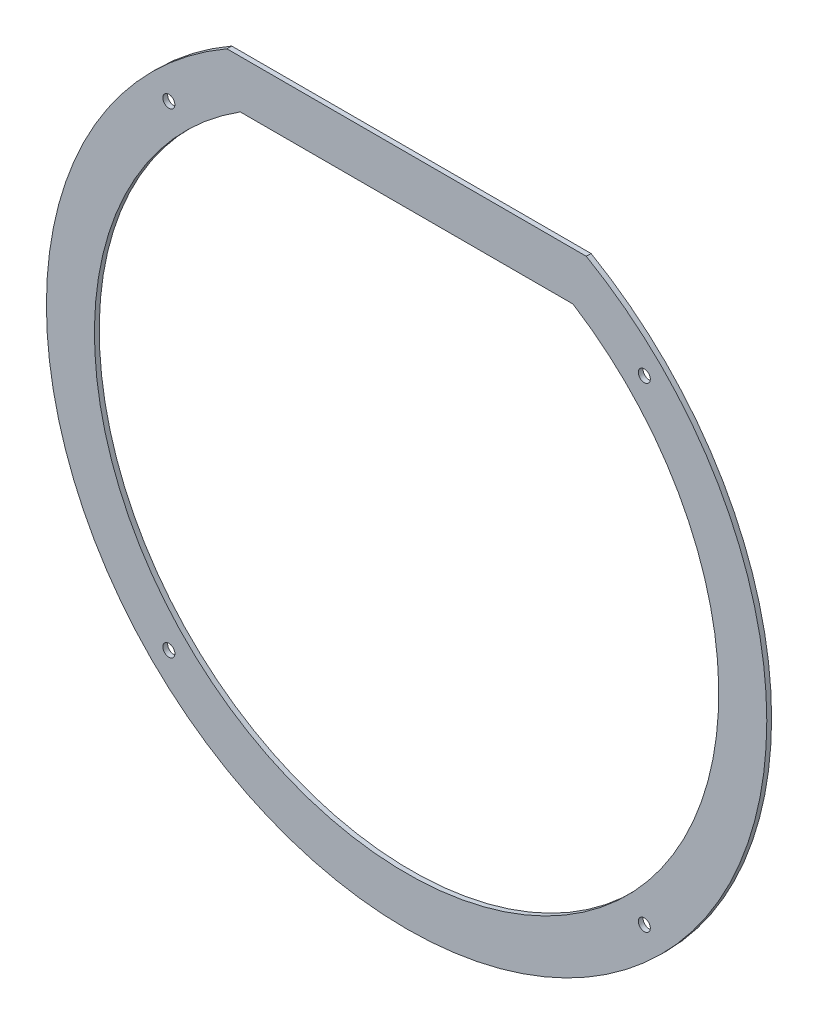
ISO-10303-21;
HEADER;
FILE_DESCRIPTION(('STEP AP214'),'2;1');
FILE_NAME('part.step','',(''),(''),'','','');
FILE_SCHEMA(('AUTOMOTIVE_DESIGN { 1 0 10303 214 1 1 1 1 }'));
ENDSEC;
DATA;
#1=APPLICATION_CONTEXT('core data for automotive mechanical design processes');
#2=APPLICATION_PROTOCOL_DEFINITION('international standard','automotive_design',2000,#1);
#3=PRODUCT_CONTEXT('',#1,'mechanical');
#4=PRODUCT('Part','Part','',(#3));
#5=PRODUCT_RELATED_PRODUCT_CATEGORY('part','',(#4));
#6=PRODUCT_DEFINITION_FORMATION('','',#4);
#7=PRODUCT_DEFINITION_CONTEXT('part definition',#1,'design');
#8=PRODUCT_DEFINITION('design','',#6,#7);
#9=PRODUCT_DEFINITION_SHAPE('','',#8);
#10=(LENGTH_UNIT() NAMED_UNIT(*) SI_UNIT(.MILLI.,.METRE.));
#11=(NAMED_UNIT(*) PLANE_ANGLE_UNIT() SI_UNIT($,.RADIAN.));
#12=(NAMED_UNIT(*) SI_UNIT($,.STERADIAN.) SOLID_ANGLE_UNIT());
#13=UNCERTAINTY_MEASURE_WITH_UNIT(LENGTH_MEASURE(1.E-05),#10,'distance_accuracy_value','');
#14=(GEOMETRIC_REPRESENTATION_CONTEXT(3) GLOBAL_UNCERTAINTY_ASSIGNED_CONTEXT((#13)) GLOBAL_UNIT_ASSIGNED_CONTEXT((#10,
#11,#12)) REPRESENTATION_CONTEXT('',''));
#15=CARTESIAN_POINT('',(0.,0.,0.));
#16=DIRECTION('',(0.,0.,1.));
#17=DIRECTION('',(1.,0.,0.));
#18=AXIS2_PLACEMENT_3D('',#15,#16,#17);
#19=CARTESIAN_POINT('',(0.,0.,2.));
#20=DIRECTION('',(0.,0.,1.));
#21=DIRECTION('',(1.,0.,0.));
#22=AXIS2_PLACEMENT_3D('',#19,#20,#21);
#23=PLANE('',#22);
#24=CARTESIAN_POINT('',(98.9949493661172,-98.9949493661161,2.));
#25=DIRECTION('',(0.,0.,1.));
#26=DIRECTION('',(1.,0.,0.));
#27=AXIS2_PLACEMENT_3D('',#24,#25,#26);
#28=CIRCLE('',#27,2.5);
#29=CARTESIAN_POINT('',(101.494949366117,-98.9949493661161,2.));
#30=VERTEX_POINT('',#29);
#31=EDGE_CURVE('E217',#30,#30,#28,.T.);
#32=ORIENTED_EDGE('',*,*,#31,.F.);
#33=EDGE_LOOP('',(#32));
#34=FACE_BOUND('',#33,.T.);
#35=CARTESIAN_POINT('',(-98.9949493661172,98.9949493661161,2.));
#36=DIRECTION('',(0.,0.,1.));
#37=DIRECTION('',(1.,0.,0.));
#38=AXIS2_PLACEMENT_3D('',#35,#36,#37);
#39=CIRCLE('',#38,2.5);
#40=CARTESIAN_POINT('',(-96.4949493661172,98.9949493661161,2.));
#41=VERTEX_POINT('',#40);
#42=EDGE_CURVE('E91',#41,#41,#39,.T.);
#43=ORIENTED_EDGE('',*,*,#42,.F.);
#44=EDGE_LOOP('',(#43));
#45=FACE_BOUND('',#44,.T.);
#46=CARTESIAN_POINT('',(0.,0.,2.));
#47=DIRECTION('',(0.,0.,1.));
#48=DIRECTION('',(1.,0.,0.));
#49=AXIS2_PLACEMENT_3D('',#46,#47,#48);
#50=CIRCLE('',#49,150.);
#51=CARTESIAN_POINT('',(-74.8331477354789,130.,2.));
#52=VERTEX_POINT('',#51);
#53=CARTESIAN_POINT('',(74.8331477354789,130.,2.));
#54=VERTEX_POINT('',#53);
#55=EDGE_CURVE('E95',#52,#54,#50,.T.);
#56=ORIENTED_EDGE('',*,*,#55,.T.);
#57=DIRECTION('',(-1.,0.,0.));
#58=VECTOR('',#57,1.);
#59=CARTESIAN_POINT('',(-74.8331477354789,130.,2.));
#60=LINE('',#59,#58);
#61=EDGE_CURVE('E98',#54,#52,#60,.T.);
#62=ORIENTED_EDGE('',*,*,#61,.T.);
#63=EDGE_LOOP('',(#56,#62));
#64=FACE_BOUND('',#63,.T.);
#65=DIRECTION('',(-1.,0.,0.));
#66=VECTOR('',#65,1.);
#67=CARTESIAN_POINT('',(-69.2820323027551,110.,2.));
#68=LINE('',#67,#66);
#69=CARTESIAN_POINT('',(69.2820323027551,110.,2.));
#70=VERTEX_POINT('',#69);
#71=CARTESIAN_POINT('',(-69.2820323027551,110.,2.));
#72=VERTEX_POINT('',#71);
#73=EDGE_CURVE('E73',#70,#72,#68,.T.);
#74=ORIENTED_EDGE('',*,*,#73,.F.);
#75=CARTESIAN_POINT('',(0.,0.,2.));
#76=DIRECTION('',(0.,0.,1.));
#77=DIRECTION('',(1.,0.,0.));
#78=AXIS2_PLACEMENT_3D('',#75,#76,#77);
#79=CIRCLE('',#78,130.);
#80=EDGE_CURVE('E79',#72,#70,#79,.T.);
#81=ORIENTED_EDGE('',*,*,#80,.F.);
#82=EDGE_LOOP('',(#74,#81));
#83=FACE_BOUND('',#82,.T.);
#84=CARTESIAN_POINT('',(-98.9949493661164,-98.9949493661169,2.));
#85=DIRECTION('',(0.,0.,1.));
#86=DIRECTION('',(1.,0.,0.));
#87=AXIS2_PLACEMENT_3D('',#84,#85,#86);
#88=CIRCLE('',#87,2.5);
#89=CARTESIAN_POINT('',(-96.4949493661164,-98.9949493661169,2.));
#90=VERTEX_POINT('',#89);
#91=EDGE_CURVE('E223',#90,#90,#88,.T.);
#92=ORIENTED_EDGE('',*,*,#91,.F.);
#93=EDGE_LOOP('',(#92));
#94=FACE_BOUND('',#93,.T.);
#95=CARTESIAN_POINT('',(98.9949493661164,98.9949493661169,2.));
#96=DIRECTION('',(0.,0.,1.));
#97=DIRECTION('',(1.,0.,0.));
#98=AXIS2_PLACEMENT_3D('',#95,#96,#97);
#99=CIRCLE('',#98,2.5);
#100=CARTESIAN_POINT('',(101.494949366116,98.9949493661169,2.));
#101=VERTEX_POINT('',#100);
#102=EDGE_CURVE('E208',#101,#101,#99,.T.);
#103=ORIENTED_EDGE('',*,*,#102,.F.);
#104=EDGE_LOOP('',(#103));
#105=FACE_BOUND('',#104,.T.);
#106=ADVANCED_FACE('F33',(#34,#45,#64,#83,#94,#105),#23,.T.);
#107=CARTESIAN_POINT('',(0.,0.,0.));
#108=DIRECTION('',(0.,0.,1.));
#109=DIRECTION('',(1.,0.,0.));
#110=AXIS2_PLACEMENT_3D('',#107,#108,#109);
#111=PLANE('',#110);
#112=CARTESIAN_POINT('',(98.9949493661172,-98.9949493661161,0.));
#113=DIRECTION('',(0.,0.,1.));
#114=DIRECTION('',(1.,0.,0.));
#115=AXIS2_PLACEMENT_3D('',#112,#113,#114);
#116=CIRCLE('',#115,2.5);
#117=CARTESIAN_POINT('',(101.494949366117,-98.9949493661161,0.));
#118=VERTEX_POINT('',#117);
#119=EDGE_CURVE('E214',#118,#118,#116,.T.);
#120=ORIENTED_EDGE('',*,*,#119,.T.);
#121=EDGE_LOOP('',(#120));
#122=FACE_BOUND('',#121,.T.);
#123=CARTESIAN_POINT('',(-98.9949493661172,98.9949493661161,0.));
#124=DIRECTION('',(0.,0.,1.));
#125=DIRECTION('',(1.,0.,0.));
#126=AXIS2_PLACEMENT_3D('',#123,#124,#125);
#127=CIRCLE('',#126,2.5);
#128=CARTESIAN_POINT('',(-96.4949493661172,98.9949493661161,0.));
#129=VERTEX_POINT('',#128);
#130=EDGE_CURVE('E88',#129,#129,#127,.T.);
#131=ORIENTED_EDGE('',*,*,#130,.T.);
#132=EDGE_LOOP('',(#131));
#133=FACE_BOUND('',#132,.T.);
#134=CARTESIAN_POINT('',(0.,0.,0.));
#135=DIRECTION('',(0.,0.,1.));
#136=DIRECTION('',(1.,0.,0.));
#137=AXIS2_PLACEMENT_3D('',#134,#135,#136);
#138=CIRCLE('',#137,150.);
#139=CARTESIAN_POINT('',(-74.8331477354789,130.,0.));
#140=VERTEX_POINT('',#139);
#141=CARTESIAN_POINT('',(74.8331477354789,130.,0.));
#142=VERTEX_POINT('',#141);
#143=EDGE_CURVE('E94',#140,#142,#138,.T.);
#144=ORIENTED_EDGE('',*,*,#143,.F.);
#145=DIRECTION('',(-1.,0.,0.));
#146=VECTOR('',#145,1.);
#147=CARTESIAN_POINT('',(-74.8331477354789,130.,0.));
#148=LINE('',#147,#146);
#149=EDGE_CURVE('E99',#142,#140,#148,.T.);
#150=ORIENTED_EDGE('',*,*,#149,.F.);
#151=EDGE_LOOP('',(#144,#150));
#152=FACE_BOUND('',#151,.T.);
#153=CARTESIAN_POINT('',(0.,0.,0.));
#154=DIRECTION('',(0.,0.,1.));
#155=DIRECTION('',(1.,0.,0.));
#156=AXIS2_PLACEMENT_3D('',#153,#154,#155);
#157=CIRCLE('',#156,130.);
#158=CARTESIAN_POINT('',(-69.2820323027551,110.,0.));
#159=VERTEX_POINT('',#158);
#160=CARTESIAN_POINT('',(69.2820323027551,110.,0.));
#161=VERTEX_POINT('',#160);
#162=EDGE_CURVE('E55',#159,#161,#157,.T.);
#163=ORIENTED_EDGE('',*,*,#162,.T.);
#164=DIRECTION('',(-1.,0.,0.));
#165=VECTOR('',#164,1.);
#166=CARTESIAN_POINT('',(-69.2820323027551,110.,0.));
#167=LINE('',#166,#165);
#168=EDGE_CURVE('E84',#161,#159,#167,.T.);
#169=ORIENTED_EDGE('',*,*,#168,.T.);
#170=EDGE_LOOP('',(#163,#169));
#171=FACE_BOUND('',#170,.T.);
#172=CARTESIAN_POINT('',(-98.9949493661164,-98.9949493661169,0.));
#173=DIRECTION('',(0.,0.,1.));
#174=DIRECTION('',(1.,0.,0.));
#175=AXIS2_PLACEMENT_3D('',#172,#173,#174);
#176=CIRCLE('',#175,2.5);
#177=CARTESIAN_POINT('',(-96.4949493661164,-98.9949493661169,0.));
#178=VERTEX_POINT('',#177);
#179=EDGE_CURVE('E220',#178,#178,#176,.T.);
#180=ORIENTED_EDGE('',*,*,#179,.T.);
#181=EDGE_LOOP('',(#180));
#182=FACE_BOUND('',#181,.T.);
#183=CARTESIAN_POINT('',(98.9949493661164,98.9949493661169,0.));
#184=DIRECTION('',(0.,0.,1.));
#185=DIRECTION('',(1.,0.,0.));
#186=AXIS2_PLACEMENT_3D('',#183,#184,#185);
#187=CIRCLE('',#186,2.5);
#188=CARTESIAN_POINT('',(101.494949366116,98.9949493661169,0.));
#189=VERTEX_POINT('',#188);
#190=EDGE_CURVE('E211',#189,#189,#187,.T.);
#191=ORIENTED_EDGE('',*,*,#190,.T.);
#192=EDGE_LOOP('',(#191));
#193=FACE_BOUND('',#192,.T.);
#194=ADVANCED_FACE('F111',(#122,#133,#152,#171,#182,#193),#111,.F.);
#195=CARTESIAN_POINT('',(0.,0.,2.));
#196=DIRECTION('',(0.,0.,-1.));
#197=DIRECTION('',(-1.,0.,0.));
#198=AXIS2_PLACEMENT_3D('',#195,#196,#197);
#199=CYLINDRICAL_SURFACE('',#198,150.);
#200=ORIENTED_EDGE('',*,*,#143,.T.);
#201=DIRECTION('',(0.,0.,-1.));
#202=VECTOR('',#201,1.);
#203=CARTESIAN_POINT('',(74.8331477354789,130.,2.));
#204=LINE('',#203,#202);
#205=EDGE_CURVE('E11',#54,#142,#204,.T.);
#206=ORIENTED_EDGE('',*,*,#205,.F.);
#207=ORIENTED_EDGE('',*,*,#55,.F.);
#208=DIRECTION('',(0.,0.,-1.));
#209=VECTOR('',#208,1.);
#210=CARTESIAN_POINT('',(-74.8331477354789,130.,2.));
#211=LINE('',#210,#209);
#212=EDGE_CURVE('E41',#52,#140,#211,.T.);
#213=ORIENTED_EDGE('',*,*,#212,.T.);
#214=EDGE_LOOP('',(#200,#206,#207,#213));
#215=FACE_BOUND('',#214,.T.);
#216=ADVANCED_FACE('F35',(#215),#199,.T.);
#217=CARTESIAN_POINT('',(-74.8331477354789,130.,2.));
#218=DIRECTION('',(0.,-1.,0.));
#219=DIRECTION('',(0.,0.,-1.));
#220=AXIS2_PLACEMENT_3D('',#217,#218,#219);
#221=PLANE('',#220);
#222=ORIENTED_EDGE('',*,*,#149,.T.);
#223=ORIENTED_EDGE('',*,*,#212,.F.);
#224=ORIENTED_EDGE('',*,*,#61,.F.);
#225=ORIENTED_EDGE('',*,*,#205,.T.);
#226=EDGE_LOOP('',(#222,#223,#224,#225));
#227=FACE_BOUND('',#226,.T.);
#228=ADVANCED_FACE('F113',(#227),#221,.F.);
#229=CARTESIAN_POINT('',(0.,0.,2.));
#230=DIRECTION('',(0.,0.,-1.));
#231=DIRECTION('',(-1.,0.,0.));
#232=AXIS2_PLACEMENT_3D('',#229,#230,#231);
#233=CYLINDRICAL_SURFACE('',#232,130.);
#234=ORIENTED_EDGE('',*,*,#162,.F.);
#235=DIRECTION('',(0.,0.,-1.));
#236=VECTOR('',#235,1.);
#237=CARTESIAN_POINT('',(-69.2820323027551,110.,2.));
#238=LINE('',#237,#236);
#239=EDGE_CURVE('E75',#72,#159,#238,.T.);
#240=ORIENTED_EDGE('',*,*,#239,.F.);
#241=ORIENTED_EDGE('',*,*,#80,.T.);
#242=DIRECTION('',(0.,0.,-1.));
#243=VECTOR('',#242,1.);
#244=CARTESIAN_POINT('',(69.2820323027551,110.,2.));
#245=LINE('',#244,#243);
#246=EDGE_CURVE('E48',#70,#161,#245,.T.);
#247=ORIENTED_EDGE('',*,*,#246,.T.);
#248=EDGE_LOOP('',(#234,#240,#241,#247));
#249=FACE_BOUND('',#248,.T.);
#250=ADVANCED_FACE('F81',(#249),#233,.F.);
#251=CARTESIAN_POINT('',(-69.2820323027551,110.,2.));
#252=DIRECTION('',(0.,-1.,0.));
#253=DIRECTION('',(1.,0.,0.));
#254=AXIS2_PLACEMENT_3D('',#251,#252,#253);
#255=PLANE('',#254);
#256=ORIENTED_EDGE('',*,*,#168,.F.);
#257=ORIENTED_EDGE('',*,*,#246,.F.);
#258=ORIENTED_EDGE('',*,*,#73,.T.);
#259=ORIENTED_EDGE('',*,*,#239,.T.);
#260=EDGE_LOOP('',(#256,#257,#258,#259));
#261=FACE_BOUND('',#260,.T.);
#262=ADVANCED_FACE('F74',(#261),#255,.T.);
#263=CARTESIAN_POINT('',(-98.9949493661172,98.9949493661161,2.));
#264=DIRECTION('',(0.,0.,-1.));
#265=DIRECTION('',(-1.,0.,0.));
#266=AXIS2_PLACEMENT_3D('',#263,#264,#265);
#267=CYLINDRICAL_SURFACE('',#266,2.5);
#268=ORIENTED_EDGE('',*,*,#42,.T.);
#269=EDGE_LOOP('',(#268));
#270=FACE_BOUND('',#269,.T.);
#271=ORIENTED_EDGE('',*,*,#130,.F.);
#272=EDGE_LOOP('',(#271));
#273=FACE_BOUND('',#272,.T.);
#274=ADVANCED_FACE('F163',(#270,#273),#267,.F.);
#275=CARTESIAN_POINT('',(-98.9949493661164,-98.9949493661169,2.));
#276=DIRECTION('',(0.,0.,-1.));
#277=DIRECTION('',(-1.,0.,0.));
#278=AXIS2_PLACEMENT_3D('',#275,#276,#277);
#279=CYLINDRICAL_SURFACE('',#278,2.5);
#280=ORIENTED_EDGE('',*,*,#91,.T.);
#281=EDGE_LOOP('',(#280));
#282=FACE_BOUND('',#281,.T.);
#283=ORIENTED_EDGE('',*,*,#179,.F.);
#284=EDGE_LOOP('',(#283));
#285=FACE_BOUND('',#284,.T.);
#286=ADVANCED_FACE('F170',(#282,#285),#279,.F.);
#287=CARTESIAN_POINT('',(98.9949493661172,-98.9949493661161,2.));
#288=DIRECTION('',(0.,0.,-1.));
#289=DIRECTION('',(-1.,0.,0.));
#290=AXIS2_PLACEMENT_3D('',#287,#288,#289);
#291=CYLINDRICAL_SURFACE('',#290,2.5);
#292=ORIENTED_EDGE('',*,*,#31,.T.);
#293=EDGE_LOOP('',(#292));
#294=FACE_BOUND('',#293,.T.);
#295=ORIENTED_EDGE('',*,*,#119,.F.);
#296=EDGE_LOOP('',(#295));
#297=FACE_BOUND('',#296,.T.);
#298=ADVANCED_FACE('F179',(#294,#297),#291,.F.);
#299=CARTESIAN_POINT('',(98.9949493661164,98.9949493661169,2.));
#300=DIRECTION('',(0.,0.,-1.));
#301=DIRECTION('',(-1.,0.,0.));
#302=AXIS2_PLACEMENT_3D('',#299,#300,#301);
#303=CYLINDRICAL_SURFACE('',#302,2.5);
#304=ORIENTED_EDGE('',*,*,#102,.T.);
#305=EDGE_LOOP('',(#304));
#306=FACE_BOUND('',#305,.T.);
#307=ORIENTED_EDGE('',*,*,#190,.F.);
#308=EDGE_LOOP('',(#307));
#309=FACE_BOUND('',#308,.T.);
#310=ADVANCED_FACE('F188',(#306,#309),#303,.F.);
#311=CLOSED_SHELL('',(#106,#194,#216,#228,#250,#262,#274,#286,#298,#310));
#312=MANIFOLD_SOLID_BREP('B2',#311);
#313=ADVANCED_BREP_SHAPE_REPRESENTATION('',(#18,#312),#14);
#314=SHAPE_DEFINITION_REPRESENTATION(#9,#313);
ENDSEC;
END-ISO-10303-21;
